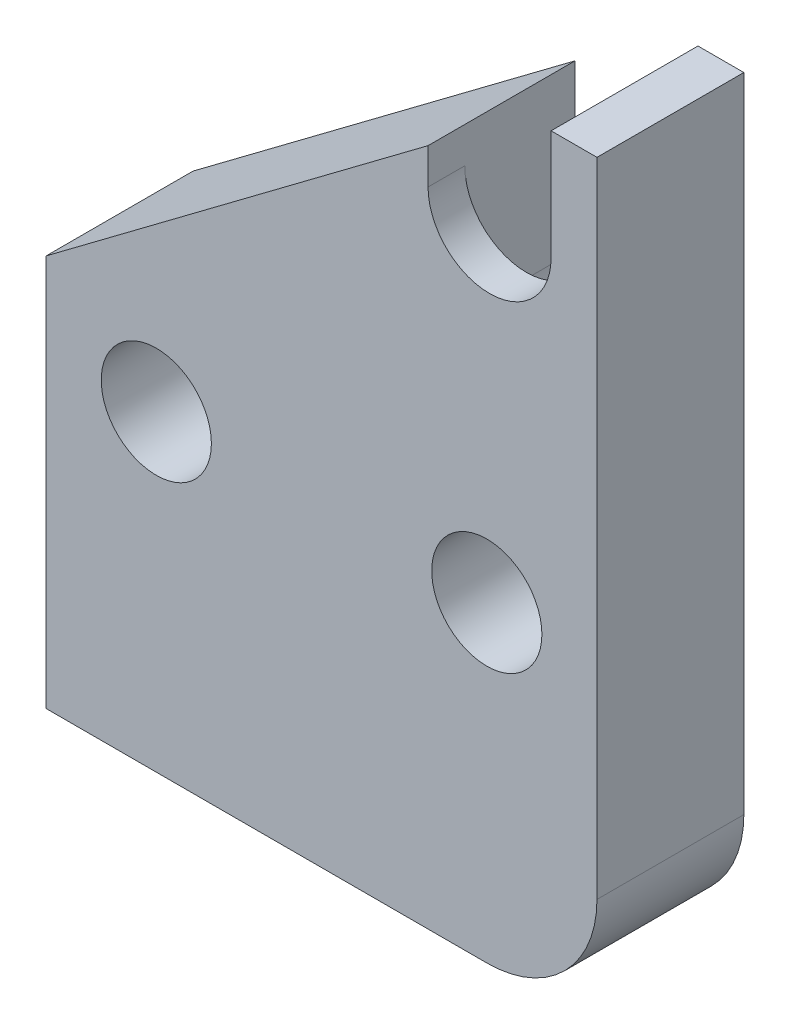
ISO-10303-21;
HEADER;
FILE_DESCRIPTION(('STEP AP214'),'2;1');
FILE_NAME('part.step','',(''),(''),'','','');
FILE_SCHEMA(('AUTOMOTIVE_DESIGN { 1 0 10303 214 1 1 1 1 }'));
ENDSEC;
DATA;
#1=APPLICATION_CONTEXT('core data for automotive mechanical design processes');
#2=APPLICATION_PROTOCOL_DEFINITION('international standard','automotive_design',2000,#1);
#3=PRODUCT_CONTEXT('',#1,'mechanical');
#4=PRODUCT('Part','Part','',(#3));
#5=PRODUCT_RELATED_PRODUCT_CATEGORY('part','',(#4));
#6=PRODUCT_DEFINITION_FORMATION('','',#4);
#7=PRODUCT_DEFINITION_CONTEXT('part definition',#1,'design');
#8=PRODUCT_DEFINITION('design','',#6,#7);
#9=PRODUCT_DEFINITION_SHAPE('','',#8);
#10=(LENGTH_UNIT() NAMED_UNIT(*) SI_UNIT(.MILLI.,.METRE.));
#11=(NAMED_UNIT(*) PLANE_ANGLE_UNIT() SI_UNIT($,.RADIAN.));
#12=(NAMED_UNIT(*) SI_UNIT($,.STERADIAN.) SOLID_ANGLE_UNIT());
#13=UNCERTAINTY_MEASURE_WITH_UNIT(LENGTH_MEASURE(1.E-05),#10,'distance_accuracy_value','');
#14=(GEOMETRIC_REPRESENTATION_CONTEXT(3) GLOBAL_UNCERTAINTY_ASSIGNED_CONTEXT((#13)) GLOBAL_UNIT_ASSIGNED_CONTEXT((#10,
#11,#12)) REPRESENTATION_CONTEXT('',''));
#15=CARTESIAN_POINT('',(0.,0.,0.));
#16=DIRECTION('',(0.,0.,1.));
#17=DIRECTION('',(1.,0.,0.));
#18=AXIS2_PLACEMENT_3D('',#15,#16,#17);
#19=CARTESIAN_POINT('',(-1.9,20.5,4.));
#20=DIRECTION('',(0.,-1.,0.));
#21=DIRECTION('',(0.,0.,-1.));
#22=AXIS2_PLACEMENT_3D('',#19,#20,#21);
#23=PLANE('',#22);
#24=DIRECTION('',(-1.,0.,0.));
#25=VECTOR('',#24,1.);
#26=CARTESIAN_POINT('',(-1.9,20.5,0.));
#27=LINE('',#26,#25);
#28=CARTESIAN_POINT('',(0.,20.5,0.));
#29=VERTEX_POINT('',#28);
#30=CARTESIAN_POINT('',(-1.25,20.5,0.));
#31=VERTEX_POINT('',#30);
#32=EDGE_CURVE('E119',#29,#31,#27,.T.);
#33=ORIENTED_EDGE('',*,*,#32,.T.);
#34=DIRECTION('',(0.,0.,1.));
#35=VECTOR('',#34,1.);
#36=CARTESIAN_POINT('',(-1.25,20.5,4.));
#37=LINE('',#36,#35);
#38=CARTESIAN_POINT('',(-1.25,20.5,4.));
#39=VERTEX_POINT('',#38);
#40=EDGE_CURVE('E122',#31,#39,#37,.T.);
#41=ORIENTED_EDGE('',*,*,#40,.T.);
#42=DIRECTION('',(-1.,0.,0.));
#43=VECTOR('',#42,1.);
#44=CARTESIAN_POINT('',(-1.9,20.5,4.));
#45=LINE('',#44,#43);
#46=CARTESIAN_POINT('',(0.,20.5,4.));
#47=VERTEX_POINT('',#46);
#48=EDGE_CURVE('E188',#47,#39,#45,.T.);
#49=ORIENTED_EDGE('',*,*,#48,.F.);
#50=DIRECTION('',(0.,0.,-1.));
#51=VECTOR('',#50,1.);
#52=CARTESIAN_POINT('',(0.,20.5,4.));
#53=LINE('',#52,#51);
#54=EDGE_CURVE('E125',#47,#29,#53,.T.);
#55=ORIENTED_EDGE('',*,*,#54,.T.);
#56=EDGE_LOOP('',(#33,#41,#49,#55));
#57=FACE_BOUND('',#56,.T.);
#58=ADVANCED_FACE('F34',(#57),#23,.F.);
#59=CARTESIAN_POINT('',(-15.,10.675,4.));
#60=DIRECTION('',(0.6,-0.8,0.));
#61=DIRECTION('',(0.8,0.6,0.));
#62=AXIS2_PLACEMENT_3D('',#59,#60,#61);
#63=PLANE('',#62);
#64=DIRECTION('',(-0.8,-0.6,0.));
#65=VECTOR('',#64,1.);
#66=CARTESIAN_POINT('',(-15.,10.675,4.));
#67=LINE('',#66,#65);
#68=CARTESIAN_POINT('',(-4.6,18.475,4.));
#69=VERTEX_POINT('',#68);
#70=CARTESIAN_POINT('',(-15.,10.675,4.));
#71=VERTEX_POINT('',#70);
#72=EDGE_CURVE('E190',#69,#71,#67,.T.);
#73=ORIENTED_EDGE('',*,*,#72,.F.);
#74=DIRECTION('',(0.,0.,-1.));
#75=VECTOR('',#74,1.);
#76=CARTESIAN_POINT('',(-4.6,18.475,4.));
#77=LINE('',#76,#75);
#78=CARTESIAN_POINT('',(-4.6,18.475,0.));
#79=VERTEX_POINT('',#78);
#80=EDGE_CURVE('E130',#69,#79,#77,.T.);
#81=ORIENTED_EDGE('',*,*,#80,.T.);
#82=DIRECTION('',(-0.8,-0.6,0.));
#83=VECTOR('',#82,1.);
#84=CARTESIAN_POINT('',(-15.,10.675,0.));
#85=LINE('',#84,#83);
#86=CARTESIAN_POINT('',(-15.,10.675,0.));
#87=VERTEX_POINT('',#86);
#88=EDGE_CURVE('E129',#79,#87,#85,.T.);
#89=ORIENTED_EDGE('',*,*,#88,.T.);
#90=DIRECTION('',(0.,0.,-1.));
#91=VECTOR('',#90,1.);
#92=CARTESIAN_POINT('',(-15.,10.675,4.));
#93=LINE('',#92,#91);
#94=EDGE_CURVE('E209',#71,#87,#93,.T.);
#95=ORIENTED_EDGE('',*,*,#94,.F.);
#96=EDGE_LOOP('',(#73,#81,#89,#95));
#97=FACE_BOUND('',#96,.T.);
#98=ADVANCED_FACE('F243',(#97),#63,.F.);
#99=CARTESIAN_POINT('',(-15.,0.,4.));
#100=DIRECTION('',(1.,0.,0.));
#101=DIRECTION('',(0.,0.,-1.));
#102=AXIS2_PLACEMENT_3D('',#99,#100,#101);
#103=PLANE('',#102);
#104=DIRECTION('',(0.,-1.,0.));
#105=VECTOR('',#104,1.);
#106=CARTESIAN_POINT('',(-15.,0.,0.));
#107=LINE('',#106,#105);
#108=CARTESIAN_POINT('',(-15.,0.,0.));
#109=VERTEX_POINT('',#108);
#110=EDGE_CURVE('E200',#87,#109,#107,.T.);
#111=ORIENTED_EDGE('',*,*,#110,.T.);
#112=DIRECTION('',(0.,0.,-1.));
#113=VECTOR('',#112,1.);
#114=CARTESIAN_POINT('',(-15.,0.,4.));
#115=LINE('',#114,#113);
#116=CARTESIAN_POINT('',(-15.,0.,4.));
#117=VERTEX_POINT('',#116);
#118=EDGE_CURVE('E206',#117,#109,#115,.T.);
#119=ORIENTED_EDGE('',*,*,#118,.F.);
#120=DIRECTION('',(0.,-1.,0.));
#121=VECTOR('',#120,1.);
#122=CARTESIAN_POINT('',(-15.,0.,4.));
#123=LINE('',#122,#121);
#124=EDGE_CURVE('E193',#71,#117,#123,.T.);
#125=ORIENTED_EDGE('',*,*,#124,.F.);
#126=ORIENTED_EDGE('',*,*,#94,.T.);
#127=EDGE_LOOP('',(#111,#119,#125,#126));
#128=FACE_BOUND('',#127,.T.);
#129=ADVANCED_FACE('F246',(#128),#103,.F.);
#130=CARTESIAN_POINT('',(0.,0.,4.));
#131=DIRECTION('',(0.,1.,0.));
#132=DIRECTION('',(-1.,0.,0.));
#133=AXIS2_PLACEMENT_3D('',#130,#131,#132);
#134=PLANE('',#133);
#135=DIRECTION('',(1.,0.,0.));
#136=VECTOR('',#135,1.);
#137=CARTESIAN_POINT('',(0.,0.,0.));
#138=LINE('',#137,#136);
#139=CARTESIAN_POINT('',(-3.,0.,0.));
#140=VERTEX_POINT('',#139);
#141=EDGE_CURVE('E202',#109,#140,#138,.T.);
#142=ORIENTED_EDGE('',*,*,#141,.T.);
#143=DIRECTION('',(0.,0.,-1.));
#144=VECTOR('',#143,1.);
#145=CARTESIAN_POINT('',(-3.,0.,4.));
#146=LINE('',#145,#144);
#147=CARTESIAN_POINT('',(-3.,0.,4.));
#148=VERTEX_POINT('',#147);
#149=EDGE_CURVE('E42',#140,#148,#146,.F.);
#150=ORIENTED_EDGE('',*,*,#149,.T.);
#151=DIRECTION('',(1.,0.,0.));
#152=VECTOR('',#151,1.);
#153=CARTESIAN_POINT('',(0.,0.,4.));
#154=LINE('',#153,#152);
#155=EDGE_CURVE('E195',#117,#148,#154,.T.);
#156=ORIENTED_EDGE('',*,*,#155,.F.);
#157=ORIENTED_EDGE('',*,*,#118,.T.);
#158=EDGE_LOOP('',(#142,#150,#156,#157));
#159=FACE_BOUND('',#158,.T.);
#160=ADVANCED_FACE('F220',(#159),#134,.F.);
#161=CARTESIAN_POINT('',(0.,20.5,4.));
#162=DIRECTION('',(-1.,0.,0.));
#163=DIRECTION('',(0.,-1.,0.));
#164=AXIS2_PLACEMENT_3D('',#161,#162,#163);
#165=PLANE('',#164);
#166=DIRECTION('',(0.,1.,0.));
#167=VECTOR('',#166,1.);
#168=CARTESIAN_POINT('',(0.,20.5,4.));
#169=LINE('',#168,#167);
#170=CARTESIAN_POINT('',(0.,3.,4.));
#171=VERTEX_POINT('',#170);
#172=EDGE_CURVE('E197',#171,#47,#169,.T.);
#173=ORIENTED_EDGE('',*,*,#172,.F.);
#174=DIRECTION('',(0.,0.,-1.));
#175=VECTOR('',#174,1.);
#176=CARTESIAN_POINT('',(0.,3.,4.));
#177=LINE('',#176,#175);
#178=CARTESIAN_POINT('',(0.,3.,0.));
#179=VERTEX_POINT('',#178);
#180=EDGE_CURVE('E212',#171,#179,#177,.T.);
#181=ORIENTED_EDGE('',*,*,#180,.T.);
#182=DIRECTION('',(0.,1.,0.));
#183=VECTOR('',#182,1.);
#184=CARTESIAN_POINT('',(0.,20.5,0.));
#185=LINE('',#184,#183);
#186=EDGE_CURVE('E191',#179,#29,#185,.T.);
#187=ORIENTED_EDGE('',*,*,#186,.T.);
#188=ORIENTED_EDGE('',*,*,#54,.F.);
#189=EDGE_LOOP('',(#173,#181,#187,#188));
#190=FACE_BOUND('',#189,.T.);
#191=ADVANCED_FACE('F228',(#190),#165,.F.);
#192=CARTESIAN_POINT('',(0.,20.5,4.));
#193=DIRECTION('',(0.,0.,-1.));
#194=DIRECTION('',(-1.,0.,0.));
#195=AXIS2_PLACEMENT_3D('',#192,#193,#194);
#196=PLANE('',#195);
#197=CARTESIAN_POINT('',(-12.,8.5,4.));
#198=DIRECTION('',(0.,0.,1.));
#199=DIRECTION('',(1.,0.,0.));
#200=AXIS2_PLACEMENT_3D('',#197,#198,#199);
#201=CIRCLE('',#200,1.5);
#202=CARTESIAN_POINT('',(-10.5,8.5,4.));
#203=VERTEX_POINT('',#202);
#204=EDGE_CURVE('E139',#203,#203,#201,.T.);
#205=ORIENTED_EDGE('',*,*,#204,.F.);
#206=EDGE_LOOP('',(#205));
#207=FACE_BOUND('',#206,.T.);
#208=CARTESIAN_POINT('',(-3.,8.5,4.));
#209=DIRECTION('',(0.,0.,1.));
#210=DIRECTION('',(1.,0.,0.));
#211=AXIS2_PLACEMENT_3D('',#208,#209,#210);
#212=CIRCLE('',#211,1.5);
#213=CARTESIAN_POINT('',(-1.5,8.5,4.));
#214=VERTEX_POINT('',#213);
#215=EDGE_CURVE('E170',#214,#214,#212,.T.);
#216=ORIENTED_EDGE('',*,*,#215,.F.);
#217=EDGE_LOOP('',(#216));
#218=FACE_BOUND('',#217,.T.);
#219=CARTESIAN_POINT('',(-2.925,17.5,4.));
#220=DIRECTION('',(0.,0.,1.));
#221=DIRECTION('',(-1.,0.,0.));
#222=AXIS2_PLACEMENT_3D('',#219,#220,#221);
#223=CIRCLE('',#222,1.675);
#224=CARTESIAN_POINT('',(-4.6,17.5,4.));
#225=VERTEX_POINT('',#224);
#226=CARTESIAN_POINT('',(-1.25,17.5,4.));
#227=VERTEX_POINT('',#226);
#228=EDGE_CURVE('E155',#225,#227,#223,.T.);
#229=ORIENTED_EDGE('',*,*,#228,.F.);
#230=DIRECTION('',(0.,-1.,0.));
#231=VECTOR('',#230,1.);
#232=CARTESIAN_POINT('',(-4.6,17.5,4.));
#233=LINE('',#232,#231);
#234=EDGE_CURVE('E151',#69,#225,#233,.T.);
#235=ORIENTED_EDGE('',*,*,#234,.F.);
#236=ORIENTED_EDGE('',*,*,#72,.T.);
#237=ORIENTED_EDGE('',*,*,#124,.T.);
#238=ORIENTED_EDGE('',*,*,#155,.T.);
#239=CARTESIAN_POINT('',(-3.,3.,4.));
#240=DIRECTION('',(0.,0.,-1.));
#241=DIRECTION('',(-1.,0.,0.));
#242=AXIS2_PLACEMENT_3D('',#239,#240,#241);
#243=CIRCLE('',#242,3.);
#244=EDGE_CURVE('E11',#148,#171,#243,.F.);
#245=ORIENTED_EDGE('',*,*,#244,.T.);
#246=ORIENTED_EDGE('',*,*,#172,.T.);
#247=ORIENTED_EDGE('',*,*,#48,.T.);
#248=DIRECTION('',(0.,1.,0.));
#249=VECTOR('',#248,1.);
#250=CARTESIAN_POINT('',(-1.25,23.3866604776267,4.));
#251=LINE('',#250,#249);
#252=EDGE_CURVE('E138',#227,#39,#251,.T.);
#253=ORIENTED_EDGE('',*,*,#252,.F.);
#254=EDGE_LOOP('',(#229,#235,#236,#237,#238,#245,#246,#247,#253));
#255=FACE_BOUND('',#254,.T.);
#256=ADVANCED_FACE('F226',(#207,#218,#255),#196,.F.);
#257=CARTESIAN_POINT('',(0.,20.5,0.));
#258=DIRECTION('',(0.,0.,-1.));
#259=DIRECTION('',(-1.,0.,0.));
#260=AXIS2_PLACEMENT_3D('',#257,#258,#259);
#261=PLANE('',#260);
#262=CARTESIAN_POINT('',(-12.,8.5,0.));
#263=DIRECTION('',(0.,0.,-1.));
#264=DIRECTION('',(-1.,0.,0.));
#265=AXIS2_PLACEMENT_3D('',#262,#263,#264);
#266=CIRCLE('',#265,1.5);
#267=CARTESIAN_POINT('',(-13.5,8.5,0.));
#268=VERTEX_POINT('',#267);
#269=EDGE_CURVE('E167',#268,#268,#266,.F.);
#270=ORIENTED_EDGE('',*,*,#269,.T.);
#271=EDGE_LOOP('',(#270));
#272=FACE_BOUND('',#271,.T.);
#273=CARTESIAN_POINT('',(-3.,8.5,0.));
#274=DIRECTION('',(0.,0.,-1.));
#275=DIRECTION('',(-1.,0.,0.));
#276=AXIS2_PLACEMENT_3D('',#273,#274,#275);
#277=CIRCLE('',#276,1.5);
#278=CARTESIAN_POINT('',(-4.5,8.5,0.));
#279=VERTEX_POINT('',#278);
#280=EDGE_CURVE('E173',#279,#279,#277,.F.);
#281=ORIENTED_EDGE('',*,*,#280,.T.);
#282=EDGE_LOOP('',(#281));
#283=FACE_BOUND('',#282,.T.);
#284=ORIENTED_EDGE('',*,*,#186,.F.);
#285=CARTESIAN_POINT('',(-3.,3.,0.));
#286=DIRECTION('',(0.,0.,-1.));
#287=DIRECTION('',(-1.,0.,0.));
#288=AXIS2_PLACEMENT_3D('',#285,#286,#287);
#289=CIRCLE('',#288,3.);
#290=EDGE_CURVE('E215',#179,#140,#289,.T.);
#291=ORIENTED_EDGE('',*,*,#290,.T.);
#292=ORIENTED_EDGE('',*,*,#141,.F.);
#293=ORIENTED_EDGE('',*,*,#110,.F.);
#294=ORIENTED_EDGE('',*,*,#88,.F.);
#295=DIRECTION('',(0.,1.,0.));
#296=VECTOR('',#295,1.);
#297=CARTESIAN_POINT('',(-4.6,21.5253605881022,0.));
#298=LINE('',#297,#296);
#299=CARTESIAN_POINT('',(-4.6,14.,0.));
#300=VERTEX_POINT('',#299);
#301=EDGE_CURVE('E178',#300,#79,#298,.T.);
#302=ORIENTED_EDGE('',*,*,#301,.F.);
#303=CARTESIAN_POINT('',(-2.5,14.,0.));
#304=DIRECTION('',(0.,0.,-1.));
#305=DIRECTION('',(1.,0.,0.));
#306=AXIS2_PLACEMENT_3D('',#303,#304,#305);
#307=CIRCLE('',#306,2.1);
#308=CARTESIAN_POINT('',(-1.25,15.6874537030686,0.));
#309=VERTEX_POINT('',#308);
#310=EDGE_CURVE('E144',#309,#300,#307,.T.);
#311=ORIENTED_EDGE('',*,*,#310,.F.);
#312=DIRECTION('',(0.,1.,0.));
#313=VECTOR('',#312,1.);
#314=CARTESIAN_POINT('',(-1.25,20.5,0.));
#315=LINE('',#314,#313);
#316=EDGE_CURVE('E136',#309,#31,#315,.T.);
#317=ORIENTED_EDGE('',*,*,#316,.T.);
#318=ORIENTED_EDGE('',*,*,#32,.F.);
#319=EDGE_LOOP('',(#284,#291,#292,#293,#294,#302,#311,#317,#318));
#320=FACE_BOUND('',#319,.T.);
#321=ADVANCED_FACE('F142',(#272,#283,#320),#261,.T.);
#322=CARTESIAN_POINT('',(-2.5,14.,3.));
#323=DIRECTION('',(0.,0.,1.));
#324=DIRECTION('',(1.,0.,0.));
#325=AXIS2_PLACEMENT_3D('',#322,#323,#324);
#326=PLANE('',#325);
#327=DIRECTION('',(0.,1.,0.));
#328=VECTOR('',#327,1.);
#329=CARTESIAN_POINT('',(-1.25,20.5,3.));
#330=LINE('',#329,#328);
#331=CARTESIAN_POINT('',(-1.25,15.6874537030686,3.));
#332=VERTEX_POINT('',#331);
#333=CARTESIAN_POINT('',(-1.25,17.5,3.));
#334=VERTEX_POINT('',#333);
#335=EDGE_CURVE('E147',#332,#334,#330,.T.);
#336=ORIENTED_EDGE('',*,*,#335,.F.);
#337=CARTESIAN_POINT('',(-2.5,14.,3.));
#338=DIRECTION('',(0.,0.,-1.));
#339=DIRECTION('',(1.,0.,0.));
#340=AXIS2_PLACEMENT_3D('',#337,#338,#339);
#341=CIRCLE('',#340,2.1);
#342=CARTESIAN_POINT('',(-4.6,14.,3.));
#343=VERTEX_POINT('',#342);
#344=EDGE_CURVE('E49',#332,#343,#341,.T.);
#345=ORIENTED_EDGE('',*,*,#344,.T.);
#346=DIRECTION('',(0.,1.,0.));
#347=VECTOR('',#346,1.);
#348=CARTESIAN_POINT('',(-4.6,21.5253605881022,3.));
#349=LINE('',#348,#347);
#350=CARTESIAN_POINT('',(-4.6,17.5,2.99999999999999));
#351=VERTEX_POINT('',#350);
#352=EDGE_CURVE('E177',#343,#351,#349,.T.);
#353=ORIENTED_EDGE('',*,*,#352,.T.);
#354=CARTESIAN_POINT('',(-2.925,17.5,3.));
#355=DIRECTION('',(0.,0.,1.));
#356=DIRECTION('',(1.,0.,0.));
#357=AXIS2_PLACEMENT_3D('',#354,#355,#356);
#358=CIRCLE('',#357,1.675);
#359=EDGE_CURVE('E140',#351,#334,#358,.T.);
#360=ORIENTED_EDGE('',*,*,#359,.T.);
#361=EDGE_LOOP('',(#336,#345,#353,#360));
#362=FACE_BOUND('',#361,.T.);
#363=ADVANCED_FACE('F238',(#362),#326,.F.);
#364=CARTESIAN_POINT('',(-4.6,21.5253605881022,3.));
#365=DIRECTION('',(-1.,0.,0.));
#366=DIRECTION('',(0.,0.,1.));
#367=AXIS2_PLACEMENT_3D('',#364,#365,#366);
#368=PLANE('',#367);
#369=ORIENTED_EDGE('',*,*,#301,.T.);
#370=ORIENTED_EDGE('',*,*,#80,.F.);
#371=ORIENTED_EDGE('',*,*,#234,.T.);
#372=DIRECTION('',(0.,0.,1.));
#373=VECTOR('',#372,1.);
#374=CARTESIAN_POINT('',(-4.6,17.5,-8.27050235347902));
#375=LINE('',#374,#373);
#376=EDGE_CURVE('E154',#351,#225,#375,.T.);
#377=ORIENTED_EDGE('',*,*,#376,.F.);
#378=ORIENTED_EDGE('',*,*,#352,.F.);
#379=DIRECTION('',(0.,0.,-1.));
#380=VECTOR('',#379,1.);
#381=CARTESIAN_POINT('',(-4.6,14.,3.));
#382=LINE('',#381,#380);
#383=EDGE_CURVE('E181',#343,#300,#382,.T.);
#384=ORIENTED_EDGE('',*,*,#383,.T.);
#385=EDGE_LOOP('',(#369,#370,#371,#377,#378,#384));
#386=FACE_BOUND('',#385,.T.);
#387=ADVANCED_FACE('F236',(#386),#368,.F.);
#388=CARTESIAN_POINT('',(-2.5,14.,3.));
#389=DIRECTION('',(0.,0.,-1.));
#390=DIRECTION('',(-1.,0.,0.));
#391=AXIS2_PLACEMENT_3D('',#388,#389,#390);
#392=CYLINDRICAL_SURFACE('',#391,2.1);
#393=ORIENTED_EDGE('',*,*,#310,.T.);
#394=ORIENTED_EDGE('',*,*,#383,.F.);
#395=ORIENTED_EDGE('',*,*,#344,.F.);
#396=DIRECTION('',(0.,0.,-1.));
#397=VECTOR('',#396,1.);
#398=CARTESIAN_POINT('',(-1.25,15.6874537030686,9.55534133359965));
#399=LINE('',#398,#397);
#400=EDGE_CURVE('E145',#332,#309,#399,.T.);
#401=ORIENTED_EDGE('',*,*,#400,.T.);
#402=EDGE_LOOP('',(#393,#394,#395,#401));
#403=FACE_BOUND('',#402,.T.);
#404=ADVANCED_FACE('F239',(#403),#392,.F.);
#405=CARTESIAN_POINT('',(-3.,8.5,-4.24264068711929));
#406=DIRECTION('',(0.,0.,1.));
#407=DIRECTION('',(1.,0.,0.));
#408=AXIS2_PLACEMENT_3D('',#405,#406,#407);
#409=CYLINDRICAL_SURFACE('',#408,1.5);
#410=ORIENTED_EDGE('',*,*,#215,.T.);
#411=EDGE_LOOP('',(#410));
#412=FACE_BOUND('',#411,.T.);
#413=ORIENTED_EDGE('',*,*,#280,.F.);
#414=EDGE_LOOP('',(#413));
#415=FACE_BOUND('',#414,.T.);
#416=ADVANCED_FACE('F304',(#412,#415),#409,.F.);
#417=CARTESIAN_POINT('',(-12.,8.5,-4.24264068711929));
#418=DIRECTION('',(0.,0.,1.));
#419=DIRECTION('',(1.,0.,0.));
#420=AXIS2_PLACEMENT_3D('',#417,#418,#419);
#421=CYLINDRICAL_SURFACE('',#420,1.5);
#422=ORIENTED_EDGE('',*,*,#204,.T.);
#423=EDGE_LOOP('',(#422));
#424=FACE_BOUND('',#423,.T.);
#425=ORIENTED_EDGE('',*,*,#269,.F.);
#426=EDGE_LOOP('',(#425));
#427=FACE_BOUND('',#426,.T.);
#428=ADVANCED_FACE('F312',(#424,#427),#421,.F.);
#429=CARTESIAN_POINT('',(-3.,3.,4.));
#430=DIRECTION('',(0.,0.,-1.));
#431=DIRECTION('',(-1.,0.,0.));
#432=AXIS2_PLACEMENT_3D('',#429,#430,#431);
#433=CYLINDRICAL_SURFACE('',#432,3.);
#434=ORIENTED_EDGE('',*,*,#244,.F.);
#435=ORIENTED_EDGE('',*,*,#149,.F.);
#436=ORIENTED_EDGE('',*,*,#290,.F.);
#437=ORIENTED_EDGE('',*,*,#180,.F.);
#438=EDGE_LOOP('',(#434,#435,#436,#437));
#439=FACE_BOUND('',#438,.T.);
#440=ADVANCED_FACE('F36',(#439),#433,.T.);
#441=CARTESIAN_POINT('',(-1.25,23.3866604776267,-8.27050235347902));
#442=DIRECTION('',(1.,0.,0.));
#443=DIRECTION('',(0.,1.,0.));
#444=AXIS2_PLACEMENT_3D('',#441,#442,#443);
#445=PLANE('',#444);
#446=ORIENTED_EDGE('',*,*,#40,.F.);
#447=ORIENTED_EDGE('',*,*,#316,.F.);
#448=ORIENTED_EDGE('',*,*,#400,.F.);
#449=ORIENTED_EDGE('',*,*,#335,.T.);
#450=DIRECTION('',(0.,0.,1.));
#451=VECTOR('',#450,1.);
#452=CARTESIAN_POINT('',(-1.25,17.5,-8.27050235347902));
#453=LINE('',#452,#451);
#454=EDGE_CURVE('E159',#334,#227,#453,.T.);
#455=ORIENTED_EDGE('',*,*,#454,.T.);
#456=ORIENTED_EDGE('',*,*,#252,.T.);
#457=EDGE_LOOP('',(#446,#447,#448,#449,#455,#456));
#458=FACE_BOUND('',#457,.T.);
#459=ADVANCED_FACE('F134',(#458),#445,.F.);
#460=CARTESIAN_POINT('',(-2.925,17.5,-8.27050235347902));
#461=DIRECTION('',(0.,0.,1.));
#462=DIRECTION('',(1.,0.,0.));
#463=AXIS2_PLACEMENT_3D('',#460,#461,#462);
#464=CYLINDRICAL_SURFACE('',#463,1.675);
#465=ORIENTED_EDGE('',*,*,#376,.T.);
#466=ORIENTED_EDGE('',*,*,#228,.T.);
#467=ORIENTED_EDGE('',*,*,#454,.F.);
#468=ORIENTED_EDGE('',*,*,#359,.F.);
#469=EDGE_LOOP('',(#465,#466,#467,#468));
#470=FACE_BOUND('',#469,.T.);
#471=ADVANCED_FACE('F232',(#470),#464,.F.);
#472=CLOSED_SHELL('',(#58,#98,#129,#160,#191,#256,#321,#363,#387,#404,#416,#428,#440,#459,#471));
#473=MANIFOLD_SOLID_BREP('B2',#472);
#474=ADVANCED_BREP_SHAPE_REPRESENTATION('',(#18,#473),#14);
#475=SHAPE_DEFINITION_REPRESENTATION(#9,#474);
ENDSEC;
END-ISO-10303-21;
